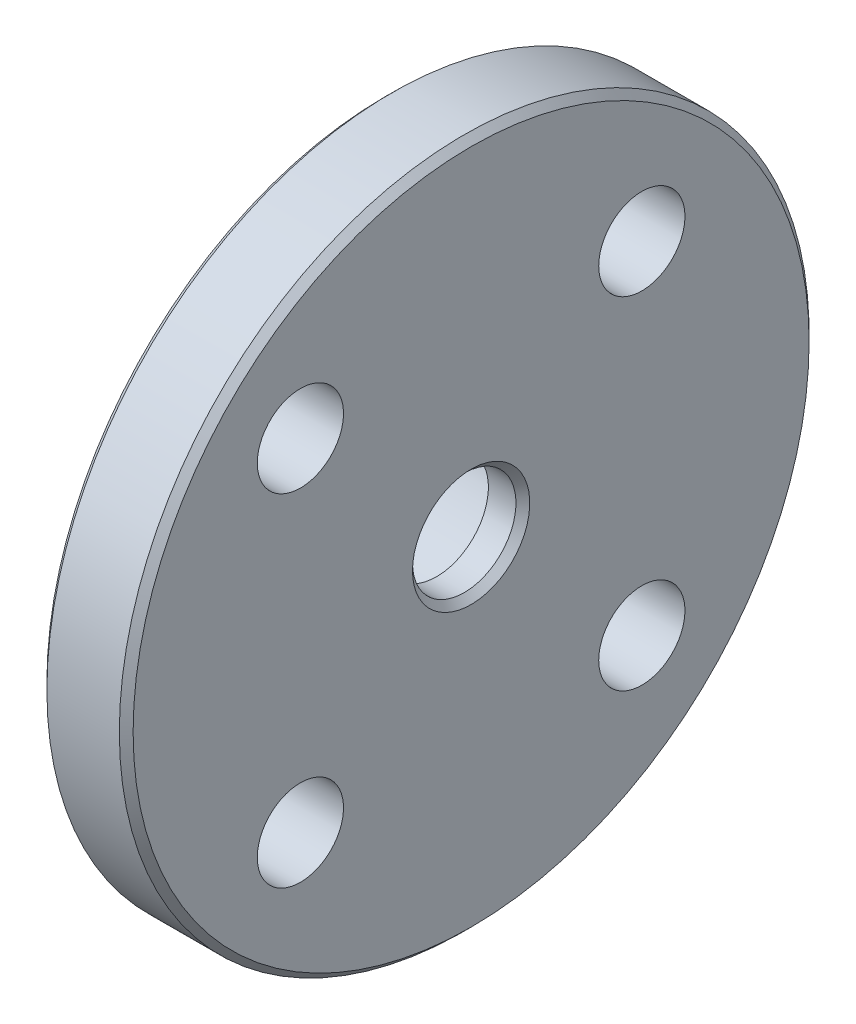
ISO-10303-21;
HEADER;
FILE_DESCRIPTION(('STEP AP214'),'2;1');
FILE_NAME('part.step','',(''),(''),'','','');
FILE_SCHEMA(('AUTOMOTIVE_DESIGN { 1 0 10303 214 1 1 1 1 }'));
ENDSEC;
DATA;
#1=APPLICATION_CONTEXT('core data for automotive mechanical design processes');
#2=APPLICATION_PROTOCOL_DEFINITION('international standard','automotive_design',2000,#1);
#3=PRODUCT_CONTEXT('',#1,'mechanical');
#4=PRODUCT('Part','Part','',(#3));
#5=PRODUCT_RELATED_PRODUCT_CATEGORY('part','',(#4));
#6=PRODUCT_DEFINITION_FORMATION('','',#4);
#7=PRODUCT_DEFINITION_CONTEXT('part definition',#1,'design');
#8=PRODUCT_DEFINITION('design','',#6,#7);
#9=PRODUCT_DEFINITION_SHAPE('','',#8);
#10=(LENGTH_UNIT() NAMED_UNIT(*) SI_UNIT(.MILLI.,.METRE.));
#11=(NAMED_UNIT(*) PLANE_ANGLE_UNIT() SI_UNIT($,.RADIAN.));
#12=(NAMED_UNIT(*) SI_UNIT($,.STERADIAN.) SOLID_ANGLE_UNIT());
#13=UNCERTAINTY_MEASURE_WITH_UNIT(LENGTH_MEASURE(1.E-05),#10,'distance_accuracy_value','');
#14=(GEOMETRIC_REPRESENTATION_CONTEXT(3) GLOBAL_UNCERTAINTY_ASSIGNED_CONTEXT((#13)) GLOBAL_UNIT_ASSIGNED_CONTEXT((#10,
#11,#12)) REPRESENTATION_CONTEXT('',''));
#15=CARTESIAN_POINT('',(0.,0.,0.));
#16=DIRECTION('',(0.,0.,1.));
#17=DIRECTION('',(1.,0.,0.));
#18=AXIS2_PLACEMENT_3D('',#15,#16,#17);
#19=CARTESIAN_POINT('',(0.,0.,0.));
#20=DIRECTION('',(-1.,0.,0.));
#21=DIRECTION('',(0.,0.,1.));
#22=AXIS2_PLACEMENT_3D('',#19,#20,#21);
#23=CYLINDRICAL_SURFACE('',#22,3.);
#24=CARTESIAN_POINT('',(3.5,0.,0.));
#25=DIRECTION('',(-1.,0.,0.));
#26=DIRECTION('',(0.,0.,1.));
#27=AXIS2_PLACEMENT_3D('',#24,#25,#26);
#28=CIRCLE('',#27,3.);
#29=CARTESIAN_POINT('',(3.5,0.,3.));
#30=VERTEX_POINT('',#29);
#31=EDGE_CURVE('E80',#30,#30,#28,.T.);
#32=ORIENTED_EDGE('',*,*,#31,.F.);
#33=EDGE_LOOP('',(#32));
#34=FACE_BOUND('',#33,.T.);
#35=CARTESIAN_POINT('',(0.,0.,0.));
#36=DIRECTION('',(-1.,0.,0.));
#37=DIRECTION('',(0.,0.,1.));
#38=AXIS2_PLACEMENT_3D('',#35,#36,#37);
#39=CIRCLE('',#38,3.);
#40=CARTESIAN_POINT('',(0.,0.,3.));
#41=VERTEX_POINT('',#40);
#42=EDGE_CURVE('E72',#41,#41,#39,.T.);
#43=ORIENTED_EDGE('',*,*,#42,.T.);
#44=EDGE_LOOP('',(#43));
#45=FACE_BOUND('',#44,.T.);
#46=ADVANCED_FACE('F39',(#34,#45),#23,.F.);
#47=CARTESIAN_POINT('',(0.,3.,0.));
#48=DIRECTION('',(1.,0.,0.));
#49=DIRECTION('',(0.,0.,-1.));
#50=AXIS2_PLACEMENT_3D('',#47,#48,#49);
#51=PLANE('',#50);
#52=CARTESIAN_POINT('',(0.,0.,0.));
#53=DIRECTION('',(1.,0.,0.));
#54=DIRECTION('',(0.,0.,-1.));
#55=AXIS2_PLACEMENT_3D('',#52,#53,#54);
#56=CIRCLE('',#55,4.3);
#57=CARTESIAN_POINT('',(0.,0.,-4.3));
#58=VERTEX_POINT('',#57);
#59=EDGE_CURVE('E46',#58,#58,#56,.F.);
#60=ORIENTED_EDGE('',*,*,#59,.T.);
#61=EDGE_LOOP('',(#60));
#62=FACE_BOUND('',#61,.T.);
#63=ORIENTED_EDGE('',*,*,#42,.F.);
#64=EDGE_LOOP('',(#63));
#65=FACE_BOUND('',#64,.T.);
#66=ADVANCED_FACE('F131',(#62,#65),#51,.F.);
#67=CARTESIAN_POINT('',(0.,0.,0.));
#68=DIRECTION('',(-1.,0.,0.));
#69=DIRECTION('',(0.,0.,1.));
#70=AXIS2_PLACEMENT_3D('',#67,#68,#69);
#71=CYLINDRICAL_SURFACE('',#70,4.5);
#72=CARTESIAN_POINT('',(0.200000000000001,0.,0.));
#73=DIRECTION('',(1.,0.,0.));
#74=DIRECTION('',(0.,0.,-1.));
#75=AXIS2_PLACEMENT_3D('',#72,#73,#74);
#76=CIRCLE('',#75,4.5);
#77=CARTESIAN_POINT('',(0.200000000000001,0.,-4.5));
#78=VERTEX_POINT('',#77);
#79=EDGE_CURVE('E10',#78,#78,#76,.T.);
#80=ORIENTED_EDGE('',*,*,#79,.T.);
#81=EDGE_LOOP('',(#80));
#82=FACE_BOUND('',#81,.T.);
#83=CARTESIAN_POINT('',(2.,0.,0.));
#84=DIRECTION('',(-1.,0.,0.));
#85=DIRECTION('',(0.,0.,1.));
#86=AXIS2_PLACEMENT_3D('',#83,#84,#85);
#87=CIRCLE('',#86,4.5);
#88=CARTESIAN_POINT('',(2.,0.,4.5));
#89=VERTEX_POINT('',#88);
#90=EDGE_CURVE('E74',#89,#89,#87,.T.);
#91=ORIENTED_EDGE('',*,*,#90,.T.);
#92=EDGE_LOOP('',(#91));
#93=FACE_BOUND('',#92,.T.);
#94=ADVANCED_FACE('F123',(#82,#93),#71,.T.);
#95=CARTESIAN_POINT('',(2.,4.5,0.));
#96=DIRECTION('',(1.,0.,0.));
#97=DIRECTION('',(0.,0.,-1.));
#98=AXIS2_PLACEMENT_3D('',#95,#96,#97);
#99=PLANE('',#98);
#100=CARTESIAN_POINT('',(2.,0.,0.));
#101=DIRECTION('',(1.,0.,0.));
#102=DIRECTION('',(0.,0.,-1.));
#103=AXIS2_PLACEMENT_3D('',#100,#101,#102);
#104=CIRCLE('',#103,9.79999999999999);
#105=CARTESIAN_POINT('',(2.,0.,-9.79999999999999));
#106=VERTEX_POINT('',#105);
#107=EDGE_CURVE('E49',#106,#106,#104,.F.);
#108=ORIENTED_EDGE('',*,*,#107,.T.);
#109=EDGE_LOOP('',(#108));
#110=FACE_BOUND('',#109,.T.);
#111=CARTESIAN_POINT('',(2.,4.94974746830582,-4.94974746830584));
#112=DIRECTION('',(-1.,0.,0.));
#113=DIRECTION('',(0.,0.,1.));
#114=AXIS2_PLACEMENT_3D('',#111,#112,#113);
#115=CIRCLE('',#114,1.25);
#116=CARTESIAN_POINT('',(2.,4.94974746830582,-3.69974746830584));
#117=VERTEX_POINT('',#116);
#118=EDGE_CURVE('E89',#117,#117,#115,.T.);
#119=ORIENTED_EDGE('',*,*,#118,.F.);
#120=EDGE_LOOP('',(#119));
#121=FACE_BOUND('',#120,.T.);
#122=CARTESIAN_POINT('',(2.,-4.94974746830584,-4.94974746830582));
#123=DIRECTION('',(-1.,0.,0.));
#124=DIRECTION('',(0.,0.,1.));
#125=AXIS2_PLACEMENT_3D('',#122,#123,#124);
#126=CIRCLE('',#125,1.25);
#127=CARTESIAN_POINT('',(2.,-4.94974746830584,-3.69974746830582));
#128=VERTEX_POINT('',#127);
#129=EDGE_CURVE('E96',#128,#128,#126,.T.);
#130=ORIENTED_EDGE('',*,*,#129,.F.);
#131=EDGE_LOOP('',(#130));
#132=FACE_BOUND('',#131,.T.);
#133=CARTESIAN_POINT('',(2.,-4.94974746830582,4.94974746830584));
#134=DIRECTION('',(-1.,0.,0.));
#135=DIRECTION('',(0.,0.,1.));
#136=AXIS2_PLACEMENT_3D('',#133,#134,#135);
#137=CIRCLE('',#136,1.25);
#138=CARTESIAN_POINT('',(2.,-4.94974746830582,6.19974746830584));
#139=VERTEX_POINT('',#138);
#140=EDGE_CURVE('E105',#139,#139,#137,.T.);
#141=ORIENTED_EDGE('',*,*,#140,.F.);
#142=EDGE_LOOP('',(#141));
#143=FACE_BOUND('',#142,.T.);
#144=CARTESIAN_POINT('',(2.,4.94974746830584,4.94974746830582));
#145=DIRECTION('',(-1.,0.,0.));
#146=DIRECTION('',(0.,0.,1.));
#147=AXIS2_PLACEMENT_3D('',#144,#145,#146);
#148=CIRCLE('',#147,1.25);
#149=CARTESIAN_POINT('',(2.,4.94974746830584,6.19974746830582));
#150=VERTEX_POINT('',#149);
#151=EDGE_CURVE('E84',#150,#150,#148,.T.);
#152=ORIENTED_EDGE('',*,*,#151,.F.);
#153=EDGE_LOOP('',(#152));
#154=FACE_BOUND('',#153,.T.);
#155=ORIENTED_EDGE('',*,*,#90,.F.);
#156=EDGE_LOOP('',(#155));
#157=FACE_BOUND('',#156,.T.);
#158=ADVANCED_FACE('F118',(#110,#121,#132,#143,#154,#157),#99,.F.);
#159=CARTESIAN_POINT('',(0.,0.,0.));
#160=DIRECTION('',(-1.,0.,0.));
#161=DIRECTION('',(0.,0.,1.));
#162=AXIS2_PLACEMENT_3D('',#159,#160,#161);
#163=CYLINDRICAL_SURFACE('',#162,10.);
#164=CARTESIAN_POINT('',(4.3,0.,0.));
#165=DIRECTION('',(-1.,0.,0.));
#166=DIRECTION('',(0.,0.,1.));
#167=AXIS2_PLACEMENT_3D('',#164,#165,#166);
#168=CIRCLE('',#167,10.);
#169=CARTESIAN_POINT('',(4.3,0.,10.));
#170=VERTEX_POINT('',#169);
#171=EDGE_CURVE('E53',#170,#170,#168,.T.);
#172=ORIENTED_EDGE('',*,*,#171,.T.);
#173=EDGE_LOOP('',(#172));
#174=FACE_BOUND('',#173,.T.);
#175=CARTESIAN_POINT('',(2.20000000000001,0.,0.));
#176=DIRECTION('',(1.,0.,0.));
#177=DIRECTION('',(0.,0.,-1.));
#178=AXIS2_PLACEMENT_3D('',#175,#176,#177);
#179=CIRCLE('',#178,10.);
#180=CARTESIAN_POINT('',(2.20000000000001,0.,-10.));
#181=VERTEX_POINT('',#180);
#182=EDGE_CURVE('E56',#181,#181,#179,.T.);
#183=ORIENTED_EDGE('',*,*,#182,.T.);
#184=EDGE_LOOP('',(#183));
#185=FACE_BOUND('',#184,.T.);
#186=ADVANCED_FACE('F125',(#174,#185),#163,.T.);
#187=CARTESIAN_POINT('',(4.5,10.,0.));
#188=DIRECTION('',(-1.,0.,0.));
#189=DIRECTION('',(0.,0.,1.));
#190=AXIS2_PLACEMENT_3D('',#187,#188,#189);
#191=PLANE('',#190);
#192=CARTESIAN_POINT('',(4.5,0.,0.));
#193=DIRECTION('',(-1.,0.,0.));
#194=DIRECTION('',(0.,0.,1.));
#195=AXIS2_PLACEMENT_3D('',#192,#193,#194);
#196=CIRCLE('',#195,1.7);
#197=CARTESIAN_POINT('',(4.5,0.,1.7));
#198=VERTEX_POINT('',#197);
#199=EDGE_CURVE('E65',#198,#198,#196,.T.);
#200=ORIENTED_EDGE('',*,*,#199,.T.);
#201=EDGE_LOOP('',(#200));
#202=FACE_BOUND('',#201,.T.);
#203=CARTESIAN_POINT('',(4.5,0.,0.));
#204=DIRECTION('',(-1.,0.,0.));
#205=DIRECTION('',(0.,0.,1.));
#206=AXIS2_PLACEMENT_3D('',#203,#204,#205);
#207=CIRCLE('',#206,9.79999999999999);
#208=CARTESIAN_POINT('',(4.5,0.,9.79999999999999));
#209=VERTEX_POINT('',#208);
#210=EDGE_CURVE('E68',#209,#209,#207,.F.);
#211=ORIENTED_EDGE('',*,*,#210,.T.);
#212=EDGE_LOOP('',(#211));
#213=FACE_BOUND('',#212,.T.);
#214=CARTESIAN_POINT('',(4.5,4.94974746830582,-4.94974746830584));
#215=DIRECTION('',(-1.,0.,0.));
#216=DIRECTION('',(0.,0.,1.));
#217=AXIS2_PLACEMENT_3D('',#214,#215,#216);
#218=CIRCLE('',#217,1.25);
#219=CARTESIAN_POINT('',(4.5,4.94974746830582,-3.69974746830584));
#220=VERTEX_POINT('',#219);
#221=EDGE_CURVE('E91',#220,#220,#218,.T.);
#222=ORIENTED_EDGE('',*,*,#221,.T.);
#223=EDGE_LOOP('',(#222));
#224=FACE_BOUND('',#223,.T.);
#225=CARTESIAN_POINT('',(4.5,-4.94974746830584,-4.94974746830582));
#226=DIRECTION('',(-1.,0.,0.));
#227=DIRECTION('',(0.,0.,1.));
#228=AXIS2_PLACEMENT_3D('',#225,#226,#227);
#229=CIRCLE('',#228,1.25);
#230=CARTESIAN_POINT('',(4.5,-4.94974746830584,-3.69974746830582));
#231=VERTEX_POINT('',#230);
#232=EDGE_CURVE('E97',#231,#231,#229,.T.);
#233=ORIENTED_EDGE('',*,*,#232,.T.);
#234=EDGE_LOOP('',(#233));
#235=FACE_BOUND('',#234,.T.);
#236=CARTESIAN_POINT('',(4.5,-4.94974746830582,4.94974746830584));
#237=DIRECTION('',(-1.,0.,0.));
#238=DIRECTION('',(0.,0.,1.));
#239=AXIS2_PLACEMENT_3D('',#236,#237,#238);
#240=CIRCLE('',#239,1.25);
#241=CARTESIAN_POINT('',(4.5,-4.94974746830582,6.19974746830584));
#242=VERTEX_POINT('',#241);
#243=EDGE_CURVE('E87',#242,#242,#240,.T.);
#244=ORIENTED_EDGE('',*,*,#243,.T.);
#245=EDGE_LOOP('',(#244));
#246=FACE_BOUND('',#245,.T.);
#247=CARTESIAN_POINT('',(4.5,4.94974746830584,4.94974746830582));
#248=DIRECTION('',(-1.,0.,0.));
#249=DIRECTION('',(0.,0.,1.));
#250=AXIS2_PLACEMENT_3D('',#247,#248,#249);
#251=CIRCLE('',#250,1.25);
#252=CARTESIAN_POINT('',(4.5,4.94974746830584,6.19974746830582));
#253=VERTEX_POINT('',#252);
#254=EDGE_CURVE('E83',#253,#253,#251,.T.);
#255=ORIENTED_EDGE('',*,*,#254,.T.);
#256=EDGE_LOOP('',(#255));
#257=FACE_BOUND('',#256,.T.);
#258=ADVANCED_FACE('F107',(#202,#213,#224,#235,#246,#257),#191,.F.);
#259=CARTESIAN_POINT('',(0.,0.,0.));
#260=DIRECTION('',(-1.,0.,0.));
#261=DIRECTION('',(0.,0.,1.));
#262=AXIS2_PLACEMENT_3D('',#259,#260,#261);
#263=CYLINDRICAL_SURFACE('',#262,1.5);
#264=CARTESIAN_POINT('',(4.30000000000001,0.,0.));
#265=DIRECTION('',(-1.,0.,0.));
#266=DIRECTION('',(0.,0.,1.));
#267=AXIS2_PLACEMENT_3D('',#264,#265,#266);
#268=CIRCLE('',#267,1.5);
#269=CARTESIAN_POINT('',(4.30000000000001,0.,1.5));
#270=VERTEX_POINT('',#269);
#271=EDGE_CURVE('E62',#270,#270,#268,.F.);
#272=ORIENTED_EDGE('',*,*,#271,.T.);
#273=EDGE_LOOP('',(#272));
#274=FACE_BOUND('',#273,.T.);
#275=CARTESIAN_POINT('',(3.5,0.,0.));
#276=DIRECTION('',(-1.,0.,0.));
#277=DIRECTION('',(0.,0.,1.));
#278=AXIS2_PLACEMENT_3D('',#275,#276,#277);
#279=CIRCLE('',#278,1.5);
#280=CARTESIAN_POINT('',(3.5,0.,1.5));
#281=VERTEX_POINT('',#280);
#282=EDGE_CURVE('E77',#281,#281,#279,.T.);
#283=ORIENTED_EDGE('',*,*,#282,.T.);
#284=EDGE_LOOP('',(#283));
#285=FACE_BOUND('',#284,.T.);
#286=ADVANCED_FACE('F184',(#274,#285),#263,.F.);
#287=CARTESIAN_POINT('',(3.5,1.5,0.));
#288=DIRECTION('',(1.,0.,0.));
#289=DIRECTION('',(0.,0.,-1.));
#290=AXIS2_PLACEMENT_3D('',#287,#288,#289);
#291=PLANE('',#290);
#292=ORIENTED_EDGE('',*,*,#282,.F.);
#293=EDGE_LOOP('',(#292));
#294=FACE_BOUND('',#293,.T.);
#295=ORIENTED_EDGE('',*,*,#31,.T.);
#296=EDGE_LOOP('',(#295));
#297=FACE_BOUND('',#296,.T.);
#298=ADVANCED_FACE('F182',(#294,#297),#291,.F.);
#299=CARTESIAN_POINT('',(4.5,4.94974746830584,4.94974746830582));
#300=DIRECTION('',(-1.,0.,0.));
#301=DIRECTION('',(0.,0.,1.));
#302=AXIS2_PLACEMENT_3D('',#299,#300,#301);
#303=CYLINDRICAL_SURFACE('',#302,1.25);
#304=CARTESIAN_POINT('',(4.5,4.94974746830584,6.19974746830582));
#305=CARTESIAN_POINT('',(4.47395833333333,4.94974746830584,6.19974746830582));
#306=CARTESIAN_POINT('',(4.44791666666667,4.94974746830584,6.19974746830582));
#307=CARTESIAN_POINT('',(4.39583333333333,4.94974746830584,6.19974746830582));
#308=CARTESIAN_POINT('',(4.36979166666667,4.94974746830584,6.19974746830582));
#309=CARTESIAN_POINT('',(4.31770833333333,4.94974746830584,6.19974746830582));
#310=CARTESIAN_POINT('',(4.29166666666667,4.94974746830584,6.19974746830582));
#311=CARTESIAN_POINT('',(4.23958333333333,4.94974746830584,6.19974746830582));
#312=CARTESIAN_POINT('',(4.21354166666667,4.94974746830584,6.19974746830582));
#313=CARTESIAN_POINT('',(4.16145833333333,4.94974746830584,6.19974746830582));
#314=CARTESIAN_POINT('',(4.13541666666667,4.94974746830584,6.19974746830582));
#315=CARTESIAN_POINT('',(4.08333333333333,4.94974746830584,6.19974746830582));
#316=CARTESIAN_POINT('',(4.05729166666667,4.94974746830584,6.19974746830582));
#317=CARTESIAN_POINT('',(4.00520833333333,4.94974746830584,6.19974746830582));
#318=CARTESIAN_POINT('',(3.97916666666667,4.94974746830584,6.19974746830582));
#319=CARTESIAN_POINT('',(3.92708333333333,4.94974746830584,6.19974746830582));
#320=CARTESIAN_POINT('',(3.90104166666667,4.94974746830584,6.19974746830582));
#321=CARTESIAN_POINT('',(3.84895833333333,4.94974746830584,6.19974746830582));
#322=CARTESIAN_POINT('',(3.82291666666667,4.94974746830584,6.19974746830582));
#323=CARTESIAN_POINT('',(3.77083333333333,4.94974746830584,6.19974746830582));
#324=CARTESIAN_POINT('',(3.74479166666667,4.94974746830584,6.19974746830582));
#325=CARTESIAN_POINT('',(3.69270833333333,4.94974746830584,6.19974746830582));
#326=CARTESIAN_POINT('',(3.66666666666667,4.94974746830584,6.19974746830582));
#327=CARTESIAN_POINT('',(3.61458333333333,4.94974746830584,6.19974746830582));
#328=CARTESIAN_POINT('',(3.58854166666667,4.94974746830584,6.19974746830582));
#329=CARTESIAN_POINT('',(3.53645833333333,4.94974746830584,6.19974746830582));
#330=CARTESIAN_POINT('',(3.51041666666667,4.94974746830584,6.19974746830582));
#331=CARTESIAN_POINT('',(3.45833333333333,4.94974746830584,6.19974746830582));
#332=CARTESIAN_POINT('',(3.43229166666667,4.94974746830584,6.19974746830582));
#333=CARTESIAN_POINT('',(3.38020833333333,4.94974746830584,6.19974746830582));
#334=CARTESIAN_POINT('',(3.35416666666667,4.94974746830584,6.19974746830582));
#335=CARTESIAN_POINT('',(3.30208333333333,4.94974746830584,6.19974746830582));
#336=CARTESIAN_POINT('',(3.27604166666667,4.94974746830584,6.19974746830582));
#337=CARTESIAN_POINT('',(3.22395833333333,4.94974746830584,6.19974746830582));
#338=CARTESIAN_POINT('',(3.19791666666667,4.94974746830584,6.19974746830582));
#339=CARTESIAN_POINT('',(3.14583333333333,4.94974746830584,6.19974746830582));
#340=CARTESIAN_POINT('',(3.11979166666667,4.94974746830584,6.19974746830582));
#341=CARTESIAN_POINT('',(3.06770833333333,4.94974746830584,6.19974746830582));
#342=CARTESIAN_POINT('',(3.04166666666667,4.94974746830584,6.19974746830582));
#343=CARTESIAN_POINT('',(2.98958333333333,4.94974746830584,6.19974746830582));
#344=CARTESIAN_POINT('',(2.96354166666667,4.94974746830584,6.19974746830582));
#345=CARTESIAN_POINT('',(2.91145833333333,4.94974746830584,6.19974746830582));
#346=CARTESIAN_POINT('',(2.88541666666667,4.94974746830584,6.19974746830582));
#347=CARTESIAN_POINT('',(2.83333333333333,4.94974746830584,6.19974746830582));
#348=CARTESIAN_POINT('',(2.80729166666667,4.94974746830584,6.19974746830582));
#349=CARTESIAN_POINT('',(2.75520833333333,4.94974746830584,6.19974746830582));
#350=CARTESIAN_POINT('',(2.72916666666667,4.94974746830584,6.19974746830582));
#351=CARTESIAN_POINT('',(2.67708333333333,4.94974746830584,6.19974746830582));
#352=CARTESIAN_POINT('',(2.65104166666667,4.94974746830584,6.19974746830582));
#353=CARTESIAN_POINT('',(2.59895833333333,4.94974746830584,6.19974746830582));
#354=CARTESIAN_POINT('',(2.57291666666667,4.94974746830584,6.19974746830582));
#355=CARTESIAN_POINT('',(2.52083333333333,4.94974746830584,6.19974746830582));
#356=CARTESIAN_POINT('',(2.49479166666667,4.94974746830584,6.19974746830582));
#357=CARTESIAN_POINT('',(2.44270833333333,4.94974746830584,6.19974746830582));
#358=CARTESIAN_POINT('',(2.41666666666667,4.94974746830584,6.19974746830582));
#359=CARTESIAN_POINT('',(2.36458333333333,4.94974746830584,6.19974746830582));
#360=CARTESIAN_POINT('',(2.33854166666667,4.94974746830584,6.19974746830582));
#361=CARTESIAN_POINT('',(2.28645833333333,4.94974746830584,6.19974746830582));
#362=CARTESIAN_POINT('',(2.26041666666667,4.94974746830584,6.19974746830582));
#363=CARTESIAN_POINT('',(2.20833333333333,4.94974746830584,6.19974746830582));
#364=CARTESIAN_POINT('',(2.18229166666667,4.94974746830584,6.19974746830582));
#365=CARTESIAN_POINT('',(2.13020833333333,4.94974746830584,6.19974746830582));
#366=CARTESIAN_POINT('',(2.10416666666667,4.94974746830584,6.19974746830582));
#367=CARTESIAN_POINT('',(2.05208333333333,4.94974746830584,6.19974746830582));
#368=CARTESIAN_POINT('',(2.02604166666667,4.94974746830584,6.19974746830582));
#369=CARTESIAN_POINT('',(2.,4.94974746830584,6.19974746830582));
#370=B_SPLINE_CURVE_WITH_KNOTS('',3,(#304,#305,#306,#307,#308,#309,#310,#311,#312,#313,#314,
#315,#316,#317,#318,#319,#320,#321,#322,#323,#324,#325,#326,#327,#328,#329,#330,#331,#332,#333,
#334,#335,#336,#337,#338,#339,#340,#341,#342,#343,#344,#345,#346,#347,#348,#349,#350,#351,#352,
#353,#354,#355,#356,#357,#358,#359,#360,#361,#362,#363,#364,#365,#366,#367,#368,#369),
.UNSPECIFIED.,.F.,.F.,(4,2,2,2,2,2,2,2,2,2,2,2,2,2,2,2,2,2,2,2,2,2,2,2,2,2,2,2,2,2,2,2,4),(0.,
0.0781249999999992,0.156249999999999,0.234374999999999,0.312499999999999,0.390625,0.46875,
0.546875,0.625,0.703125,0.78125,0.859375,0.9375,1.015625,1.09375,1.171875,1.25,1.328125,1.40625,
1.484375,1.5625,1.640625,1.71875,1.796875,1.875,1.953125,2.03125,2.109375,2.1875,2.265625,
2.34375,2.421875,2.5),.UNSPECIFIED.);
#371=EDGE_CURVE('BSEAM113',#253,#150,#370,.T.);
#372=ORIENTED_EDGE('',*,*,#254,.F.);
#373=ORIENTED_EDGE('',*,*,#151,.T.);
#374=ORIENTED_EDGE('',*,*,#371,.T.);
#375=ORIENTED_EDGE('',*,*,#371,.F.);
#376=EDGE_LOOP('',(#372,#374,#373,#375));
#377=FACE_BOUND('',#376,.T.);
#378=ADVANCED_FACE('F113',(#377),#303,.F.);
#379=CARTESIAN_POINT('',(4.5,-4.94974746830582,4.94974746830584));
#380=DIRECTION('',(-1.,0.,0.));
#381=DIRECTION('',(0.,0.,1.));
#382=AXIS2_PLACEMENT_3D('',#379,#380,#381);
#383=CYLINDRICAL_SURFACE('',#382,1.25);
#384=CARTESIAN_POINT('',(4.5,-4.94974746830582,6.19974746830584));
#385=CARTESIAN_POINT('',(4.47395833333333,-4.94974746830582,6.19974746830584));
#386=CARTESIAN_POINT('',(4.44791666666667,-4.94974746830582,6.19974746830584));
#387=CARTESIAN_POINT('',(4.39583333333333,-4.94974746830582,6.19974746830584));
#388=CARTESIAN_POINT('',(4.36979166666667,-4.94974746830582,6.19974746830584));
#389=CARTESIAN_POINT('',(4.31770833333333,-4.94974746830582,6.19974746830584));
#390=CARTESIAN_POINT('',(4.29166666666667,-4.94974746830582,6.19974746830584));
#391=CARTESIAN_POINT('',(4.23958333333333,-4.94974746830582,6.19974746830584));
#392=CARTESIAN_POINT('',(4.21354166666667,-4.94974746830582,6.19974746830584));
#393=CARTESIAN_POINT('',(4.16145833333333,-4.94974746830582,6.19974746830584));
#394=CARTESIAN_POINT('',(4.13541666666667,-4.94974746830582,6.19974746830584));
#395=CARTESIAN_POINT('',(4.08333333333333,-4.94974746830582,6.19974746830584));
#396=CARTESIAN_POINT('',(4.05729166666667,-4.94974746830582,6.19974746830584));
#397=CARTESIAN_POINT('',(4.00520833333333,-4.94974746830582,6.19974746830584));
#398=CARTESIAN_POINT('',(3.97916666666667,-4.94974746830582,6.19974746830584));
#399=CARTESIAN_POINT('',(3.92708333333333,-4.94974746830582,6.19974746830584));
#400=CARTESIAN_POINT('',(3.90104166666667,-4.94974746830582,6.19974746830584));
#401=CARTESIAN_POINT('',(3.84895833333333,-4.94974746830582,6.19974746830584));
#402=CARTESIAN_POINT('',(3.82291666666667,-4.94974746830582,6.19974746830584));
#403=CARTESIAN_POINT('',(3.77083333333333,-4.94974746830582,6.19974746830584));
#404=CARTESIAN_POINT('',(3.74479166666667,-4.94974746830582,6.19974746830584));
#405=CARTESIAN_POINT('',(3.69270833333333,-4.94974746830582,6.19974746830584));
#406=CARTESIAN_POINT('',(3.66666666666667,-4.94974746830582,6.19974746830584));
#407=CARTESIAN_POINT('',(3.61458333333333,-4.94974746830582,6.19974746830584));
#408=CARTESIAN_POINT('',(3.58854166666667,-4.94974746830582,6.19974746830584));
#409=CARTESIAN_POINT('',(3.53645833333333,-4.94974746830582,6.19974746830584));
#410=CARTESIAN_POINT('',(3.51041666666667,-4.94974746830582,6.19974746830584));
#411=CARTESIAN_POINT('',(3.45833333333333,-4.94974746830582,6.19974746830584));
#412=CARTESIAN_POINT('',(3.43229166666667,-4.94974746830582,6.19974746830584));
#413=CARTESIAN_POINT('',(3.38020833333333,-4.94974746830582,6.19974746830584));
#414=CARTESIAN_POINT('',(3.35416666666667,-4.94974746830582,6.19974746830584));
#415=CARTESIAN_POINT('',(3.30208333333333,-4.94974746830582,6.19974746830584));
#416=CARTESIAN_POINT('',(3.27604166666667,-4.94974746830582,6.19974746830584));
#417=CARTESIAN_POINT('',(3.22395833333333,-4.94974746830582,6.19974746830584));
#418=CARTESIAN_POINT('',(3.19791666666667,-4.94974746830582,6.19974746830584));
#419=CARTESIAN_POINT('',(3.14583333333333,-4.94974746830582,6.19974746830584));
#420=CARTESIAN_POINT('',(3.11979166666667,-4.94974746830582,6.19974746830584));
#421=CARTESIAN_POINT('',(3.06770833333333,-4.94974746830582,6.19974746830584));
#422=CARTESIAN_POINT('',(3.04166666666667,-4.94974746830582,6.19974746830584));
#423=CARTESIAN_POINT('',(2.98958333333333,-4.94974746830582,6.19974746830584));
#424=CARTESIAN_POINT('',(2.96354166666667,-4.94974746830582,6.19974746830584));
#425=CARTESIAN_POINT('',(2.91145833333333,-4.94974746830582,6.19974746830584));
#426=CARTESIAN_POINT('',(2.88541666666667,-4.94974746830582,6.19974746830584));
#427=CARTESIAN_POINT('',(2.83333333333333,-4.94974746830582,6.19974746830584));
#428=CARTESIAN_POINT('',(2.80729166666667,-4.94974746830582,6.19974746830584));
#429=CARTESIAN_POINT('',(2.75520833333333,-4.94974746830582,6.19974746830584));
#430=CARTESIAN_POINT('',(2.72916666666667,-4.94974746830582,6.19974746830584));
#431=CARTESIAN_POINT('',(2.67708333333333,-4.94974746830582,6.19974746830584));
#432=CARTESIAN_POINT('',(2.65104166666667,-4.94974746830582,6.19974746830584));
#433=CARTESIAN_POINT('',(2.59895833333333,-4.94974746830582,6.19974746830584));
#434=CARTESIAN_POINT('',(2.57291666666667,-4.94974746830582,6.19974746830584));
#435=CARTESIAN_POINT('',(2.52083333333333,-4.94974746830582,6.19974746830584));
#436=CARTESIAN_POINT('',(2.49479166666667,-4.94974746830582,6.19974746830584));
#437=CARTESIAN_POINT('',(2.44270833333333,-4.94974746830582,6.19974746830584));
#438=CARTESIAN_POINT('',(2.41666666666667,-4.94974746830582,6.19974746830584));
#439=CARTESIAN_POINT('',(2.36458333333333,-4.94974746830582,6.19974746830584));
#440=CARTESIAN_POINT('',(2.33854166666667,-4.94974746830582,6.19974746830584));
#441=CARTESIAN_POINT('',(2.28645833333333,-4.94974746830582,6.19974746830584));
#442=CARTESIAN_POINT('',(2.26041666666667,-4.94974746830582,6.19974746830584));
#443=CARTESIAN_POINT('',(2.20833333333333,-4.94974746830582,6.19974746830584));
#444=CARTESIAN_POINT('',(2.18229166666667,-4.94974746830582,6.19974746830584));
#445=CARTESIAN_POINT('',(2.13020833333333,-4.94974746830582,6.19974746830584));
#446=CARTESIAN_POINT('',(2.10416666666667,-4.94974746830582,6.19974746830584));
#447=CARTESIAN_POINT('',(2.05208333333333,-4.94974746830582,6.19974746830584));
#448=CARTESIAN_POINT('',(2.02604166666667,-4.94974746830582,6.19974746830584));
#449=CARTESIAN_POINT('',(2.,-4.94974746830582,6.19974746830584));
#450=B_SPLINE_CURVE_WITH_KNOTS('',3,(#384,#385,#386,#387,#388,#389,#390,#391,#392,#393,#394,
#395,#396,#397,#398,#399,#400,#401,#402,#403,#404,#405,#406,#407,#408,#409,#410,#411,#412,#413,
#414,#415,#416,#417,#418,#419,#420,#421,#422,#423,#424,#425,#426,#427,#428,#429,#430,#431,#432,
#433,#434,#435,#436,#437,#438,#439,#440,#441,#442,#443,#444,#445,#446,#447,#448,#449),
.UNSPECIFIED.,.F.,.F.,(4,2,2,2,2,2,2,2,2,2,2,2,2,2,2,2,2,2,2,2,2,2,2,2,2,2,2,2,2,2,2,2,4),(0.,
0.0781249999999992,0.156249999999999,0.234374999999999,0.312499999999999,0.390625,0.46875,
0.546875,0.625,0.703125,0.78125,0.859375,0.9375,1.015625,1.09375,1.171875,1.25,1.328125,1.40625,
1.484375,1.5625,1.640625,1.71875,1.796875,1.875,1.953125,2.03125,2.109375,2.1875,2.265625,
2.34375,2.421875,2.5),.UNSPECIFIED.);
#451=EDGE_CURVE('BSEAM112',#242,#139,#450,.T.);
#452=ORIENTED_EDGE('',*,*,#243,.F.);
#453=ORIENTED_EDGE('',*,*,#140,.T.);
#454=ORIENTED_EDGE('',*,*,#451,.T.);
#455=ORIENTED_EDGE('',*,*,#451,.F.);
#456=EDGE_LOOP('',(#452,#454,#453,#455));
#457=FACE_BOUND('',#456,.T.);
#458=ADVANCED_FACE('F112',(#457),#383,.F.);
#459=CARTESIAN_POINT('',(4.5,-4.94974746830584,-4.94974746830582));
#460=DIRECTION('',(-1.,0.,0.));
#461=DIRECTION('',(0.,0.,1.));
#462=AXIS2_PLACEMENT_3D('',#459,#460,#461);
#463=CYLINDRICAL_SURFACE('',#462,1.25);
#464=CARTESIAN_POINT('',(4.5,-4.94974746830584,-3.69974746830582));
#465=CARTESIAN_POINT('',(4.47395833333333,-4.94974746830584,-3.69974746830582));
#466=CARTESIAN_POINT('',(4.44791666666667,-4.94974746830584,-3.69974746830582));
#467=CARTESIAN_POINT('',(4.39583333333333,-4.94974746830584,-3.69974746830582));
#468=CARTESIAN_POINT('',(4.36979166666667,-4.94974746830584,-3.69974746830582));
#469=CARTESIAN_POINT('',(4.31770833333333,-4.94974746830584,-3.69974746830582));
#470=CARTESIAN_POINT('',(4.29166666666667,-4.94974746830584,-3.69974746830582));
#471=CARTESIAN_POINT('',(4.23958333333333,-4.94974746830584,-3.69974746830582));
#472=CARTESIAN_POINT('',(4.21354166666667,-4.94974746830584,-3.69974746830582));
#473=CARTESIAN_POINT('',(4.16145833333333,-4.94974746830584,-3.69974746830582));
#474=CARTESIAN_POINT('',(4.13541666666667,-4.94974746830584,-3.69974746830582));
#475=CARTESIAN_POINT('',(4.08333333333333,-4.94974746830584,-3.69974746830582));
#476=CARTESIAN_POINT('',(4.05729166666667,-4.94974746830584,-3.69974746830582));
#477=CARTESIAN_POINT('',(4.00520833333333,-4.94974746830584,-3.69974746830582));
#478=CARTESIAN_POINT('',(3.97916666666667,-4.94974746830584,-3.69974746830582));
#479=CARTESIAN_POINT('',(3.92708333333333,-4.94974746830584,-3.69974746830582));
#480=CARTESIAN_POINT('',(3.90104166666667,-4.94974746830584,-3.69974746830582));
#481=CARTESIAN_POINT('',(3.84895833333333,-4.94974746830584,-3.69974746830582));
#482=CARTESIAN_POINT('',(3.82291666666667,-4.94974746830584,-3.69974746830582));
#483=CARTESIAN_POINT('',(3.77083333333333,-4.94974746830584,-3.69974746830582));
#484=CARTESIAN_POINT('',(3.74479166666667,-4.94974746830584,-3.69974746830582));
#485=CARTESIAN_POINT('',(3.69270833333333,-4.94974746830584,-3.69974746830582));
#486=CARTESIAN_POINT('',(3.66666666666667,-4.94974746830584,-3.69974746830582));
#487=CARTESIAN_POINT('',(3.61458333333333,-4.94974746830584,-3.69974746830582));
#488=CARTESIAN_POINT('',(3.58854166666667,-4.94974746830584,-3.69974746830582));
#489=CARTESIAN_POINT('',(3.53645833333333,-4.94974746830584,-3.69974746830582));
#490=CARTESIAN_POINT('',(3.51041666666667,-4.94974746830584,-3.69974746830582));
#491=CARTESIAN_POINT('',(3.45833333333333,-4.94974746830584,-3.69974746830582));
#492=CARTESIAN_POINT('',(3.43229166666667,-4.94974746830584,-3.69974746830582));
#493=CARTESIAN_POINT('',(3.38020833333333,-4.94974746830584,-3.69974746830582));
#494=CARTESIAN_POINT('',(3.35416666666667,-4.94974746830584,-3.69974746830582));
#495=CARTESIAN_POINT('',(3.30208333333333,-4.94974746830584,-3.69974746830582));
#496=CARTESIAN_POINT('',(3.27604166666667,-4.94974746830584,-3.69974746830582));
#497=CARTESIAN_POINT('',(3.22395833333333,-4.94974746830584,-3.69974746830582));
#498=CARTESIAN_POINT('',(3.19791666666667,-4.94974746830584,-3.69974746830582));
#499=CARTESIAN_POINT('',(3.14583333333333,-4.94974746830584,-3.69974746830582));
#500=CARTESIAN_POINT('',(3.11979166666667,-4.94974746830584,-3.69974746830582));
#501=CARTESIAN_POINT('',(3.06770833333333,-4.94974746830584,-3.69974746830582));
#502=CARTESIAN_POINT('',(3.04166666666667,-4.94974746830584,-3.69974746830582));
#503=CARTESIAN_POINT('',(2.98958333333333,-4.94974746830584,-3.69974746830582));
#504=CARTESIAN_POINT('',(2.96354166666667,-4.94974746830584,-3.69974746830582));
#505=CARTESIAN_POINT('',(2.91145833333333,-4.94974746830584,-3.69974746830582));
#506=CARTESIAN_POINT('',(2.88541666666667,-4.94974746830584,-3.69974746830582));
#507=CARTESIAN_POINT('',(2.83333333333333,-4.94974746830584,-3.69974746830582));
#508=CARTESIAN_POINT('',(2.80729166666667,-4.94974746830584,-3.69974746830582));
#509=CARTESIAN_POINT('',(2.75520833333333,-4.94974746830584,-3.69974746830582));
#510=CARTESIAN_POINT('',(2.72916666666667,-4.94974746830584,-3.69974746830582));
#511=CARTESIAN_POINT('',(2.67708333333333,-4.94974746830584,-3.69974746830582));
#512=CARTESIAN_POINT('',(2.65104166666667,-4.94974746830584,-3.69974746830582));
#513=CARTESIAN_POINT('',(2.59895833333333,-4.94974746830584,-3.69974746830582));
#514=CARTESIAN_POINT('',(2.57291666666667,-4.94974746830584,-3.69974746830582));
#515=CARTESIAN_POINT('',(2.52083333333333,-4.94974746830584,-3.69974746830582));
#516=CARTESIAN_POINT('',(2.49479166666667,-4.94974746830584,-3.69974746830582));
#517=CARTESIAN_POINT('',(2.44270833333333,-4.94974746830584,-3.69974746830582));
#518=CARTESIAN_POINT('',(2.41666666666667,-4.94974746830584,-3.69974746830582));
#519=CARTESIAN_POINT('',(2.36458333333333,-4.94974746830584,-3.69974746830582));
#520=CARTESIAN_POINT('',(2.33854166666667,-4.94974746830584,-3.69974746830582));
#521=CARTESIAN_POINT('',(2.28645833333333,-4.94974746830584,-3.69974746830582));
#522=CARTESIAN_POINT('',(2.26041666666667,-4.94974746830584,-3.69974746830582));
#523=CARTESIAN_POINT('',(2.20833333333333,-4.94974746830584,-3.69974746830582));
#524=CARTESIAN_POINT('',(2.18229166666667,-4.94974746830584,-3.69974746830582));
#525=CARTESIAN_POINT('',(2.13020833333333,-4.94974746830584,-3.69974746830582));
#526=CARTESIAN_POINT('',(2.10416666666667,-4.94974746830584,-3.69974746830582));
#527=CARTESIAN_POINT('',(2.05208333333333,-4.94974746830584,-3.69974746830582));
#528=CARTESIAN_POINT('',(2.02604166666667,-4.94974746830584,-3.69974746830582));
#529=CARTESIAN_POINT('',(2.,-4.94974746830584,-3.69974746830582));
#530=B_SPLINE_CURVE_WITH_KNOTS('',3,(#464,#465,#466,#467,#468,#469,#470,#471,#472,#473,#474,
#475,#476,#477,#478,#479,#480,#481,#482,#483,#484,#485,#486,#487,#488,#489,#490,#491,#492,#493,
#494,#495,#496,#497,#498,#499,#500,#501,#502,#503,#504,#505,#506,#507,#508,#509,#510,#511,#512,
#513,#514,#515,#516,#517,#518,#519,#520,#521,#522,#523,#524,#525,#526,#527,#528,#529),
.UNSPECIFIED.,.F.,.F.,(4,2,2,2,2,2,2,2,2,2,2,2,2,2,2,2,2,2,2,2,2,2,2,2,2,2,2,2,2,2,2,2,4),(0.,
0.0781249999999992,0.156249999999999,0.234374999999999,0.312499999999999,0.390625,0.46875,
0.546875,0.625,0.703125,0.78125,0.859375,0.9375,1.015625,1.09375,1.171875,1.25,1.328125,1.40625,
1.484375,1.5625,1.640625,1.71875,1.796875,1.875,1.953125,2.03125,2.109375,2.1875,2.265625,
2.34375,2.421875,2.5),.UNSPECIFIED.);
#531=EDGE_CURVE('BSEAM111',#231,#128,#530,.T.);
#532=ORIENTED_EDGE('',*,*,#232,.F.);
#533=ORIENTED_EDGE('',*,*,#129,.T.);
#534=ORIENTED_EDGE('',*,*,#531,.T.);
#535=ORIENTED_EDGE('',*,*,#531,.F.);
#536=EDGE_LOOP('',(#532,#534,#533,#535));
#537=FACE_BOUND('',#536,.T.);
#538=ADVANCED_FACE('F111',(#537),#463,.F.);
#539=CARTESIAN_POINT('',(4.5,4.94974746830582,-4.94974746830584));
#540=DIRECTION('',(-1.,0.,0.));
#541=DIRECTION('',(0.,0.,1.));
#542=AXIS2_PLACEMENT_3D('',#539,#540,#541);
#543=CYLINDRICAL_SURFACE('',#542,1.25);
#544=CARTESIAN_POINT('',(4.5,4.94974746830582,-3.69974746830584));
#545=CARTESIAN_POINT('',(4.47395833333333,4.94974746830582,-3.69974746830584));
#546=CARTESIAN_POINT('',(4.44791666666667,4.94974746830582,-3.69974746830584));
#547=CARTESIAN_POINT('',(4.39583333333333,4.94974746830582,-3.69974746830584));
#548=CARTESIAN_POINT('',(4.36979166666667,4.94974746830582,-3.69974746830584));
#549=CARTESIAN_POINT('',(4.31770833333333,4.94974746830582,-3.69974746830584));
#550=CARTESIAN_POINT('',(4.29166666666667,4.94974746830582,-3.69974746830584));
#551=CARTESIAN_POINT('',(4.23958333333333,4.94974746830582,-3.69974746830584));
#552=CARTESIAN_POINT('',(4.21354166666667,4.94974746830582,-3.69974746830584));
#553=CARTESIAN_POINT('',(4.16145833333333,4.94974746830582,-3.69974746830584));
#554=CARTESIAN_POINT('',(4.13541666666667,4.94974746830582,-3.69974746830584));
#555=CARTESIAN_POINT('',(4.08333333333333,4.94974746830582,-3.69974746830584));
#556=CARTESIAN_POINT('',(4.05729166666667,4.94974746830582,-3.69974746830584));
#557=CARTESIAN_POINT('',(4.00520833333333,4.94974746830582,-3.69974746830584));
#558=CARTESIAN_POINT('',(3.97916666666667,4.94974746830582,-3.69974746830584));
#559=CARTESIAN_POINT('',(3.92708333333333,4.94974746830582,-3.69974746830584));
#560=CARTESIAN_POINT('',(3.90104166666667,4.94974746830582,-3.69974746830584));
#561=CARTESIAN_POINT('',(3.84895833333333,4.94974746830582,-3.69974746830584));
#562=CARTESIAN_POINT('',(3.82291666666667,4.94974746830582,-3.69974746830584));
#563=CARTESIAN_POINT('',(3.77083333333333,4.94974746830582,-3.69974746830584));
#564=CARTESIAN_POINT('',(3.74479166666667,4.94974746830582,-3.69974746830584));
#565=CARTESIAN_POINT('',(3.69270833333333,4.94974746830582,-3.69974746830584));
#566=CARTESIAN_POINT('',(3.66666666666667,4.94974746830582,-3.69974746830584));
#567=CARTESIAN_POINT('',(3.61458333333333,4.94974746830582,-3.69974746830584));
#568=CARTESIAN_POINT('',(3.58854166666667,4.94974746830582,-3.69974746830584));
#569=CARTESIAN_POINT('',(3.53645833333333,4.94974746830582,-3.69974746830584));
#570=CARTESIAN_POINT('',(3.51041666666667,4.94974746830582,-3.69974746830584));
#571=CARTESIAN_POINT('',(3.45833333333333,4.94974746830582,-3.69974746830584));
#572=CARTESIAN_POINT('',(3.43229166666667,4.94974746830582,-3.69974746830584));
#573=CARTESIAN_POINT('',(3.38020833333333,4.94974746830582,-3.69974746830584));
#574=CARTESIAN_POINT('',(3.35416666666667,4.94974746830582,-3.69974746830584));
#575=CARTESIAN_POINT('',(3.30208333333333,4.94974746830582,-3.69974746830584));
#576=CARTESIAN_POINT('',(3.27604166666667,4.94974746830582,-3.69974746830584));
#577=CARTESIAN_POINT('',(3.22395833333333,4.94974746830582,-3.69974746830584));
#578=CARTESIAN_POINT('',(3.19791666666667,4.94974746830582,-3.69974746830584));
#579=CARTESIAN_POINT('',(3.14583333333333,4.94974746830582,-3.69974746830584));
#580=CARTESIAN_POINT('',(3.11979166666667,4.94974746830582,-3.69974746830584));
#581=CARTESIAN_POINT('',(3.06770833333333,4.94974746830582,-3.69974746830584));
#582=CARTESIAN_POINT('',(3.04166666666667,4.94974746830582,-3.69974746830584));
#583=CARTESIAN_POINT('',(2.98958333333333,4.94974746830582,-3.69974746830584));
#584=CARTESIAN_POINT('',(2.96354166666667,4.94974746830582,-3.69974746830584));
#585=CARTESIAN_POINT('',(2.91145833333333,4.94974746830582,-3.69974746830584));
#586=CARTESIAN_POINT('',(2.88541666666667,4.94974746830582,-3.69974746830584));
#587=CARTESIAN_POINT('',(2.83333333333333,4.94974746830582,-3.69974746830584));
#588=CARTESIAN_POINT('',(2.80729166666667,4.94974746830582,-3.69974746830584));
#589=CARTESIAN_POINT('',(2.75520833333333,4.94974746830582,-3.69974746830584));
#590=CARTESIAN_POINT('',(2.72916666666667,4.94974746830582,-3.69974746830584));
#591=CARTESIAN_POINT('',(2.67708333333333,4.94974746830582,-3.69974746830584));
#592=CARTESIAN_POINT('',(2.65104166666667,4.94974746830582,-3.69974746830584));
#593=CARTESIAN_POINT('',(2.59895833333333,4.94974746830582,-3.69974746830584));
#594=CARTESIAN_POINT('',(2.57291666666667,4.94974746830582,-3.69974746830584));
#595=CARTESIAN_POINT('',(2.52083333333333,4.94974746830582,-3.69974746830584));
#596=CARTESIAN_POINT('',(2.49479166666667,4.94974746830582,-3.69974746830584));
#597=CARTESIAN_POINT('',(2.44270833333333,4.94974746830582,-3.69974746830584));
#598=CARTESIAN_POINT('',(2.41666666666667,4.94974746830582,-3.69974746830584));
#599=CARTESIAN_POINT('',(2.36458333333333,4.94974746830582,-3.69974746830584));
#600=CARTESIAN_POINT('',(2.33854166666667,4.94974746830582,-3.69974746830584));
#601=CARTESIAN_POINT('',(2.28645833333333,4.94974746830582,-3.69974746830584));
#602=CARTESIAN_POINT('',(2.26041666666667,4.94974746830582,-3.69974746830584));
#603=CARTESIAN_POINT('',(2.20833333333333,4.94974746830582,-3.69974746830584));
#604=CARTESIAN_POINT('',(2.18229166666667,4.94974746830582,-3.69974746830584));
#605=CARTESIAN_POINT('',(2.13020833333333,4.94974746830582,-3.69974746830584));
#606=CARTESIAN_POINT('',(2.10416666666667,4.94974746830582,-3.69974746830584));
#607=CARTESIAN_POINT('',(2.05208333333333,4.94974746830582,-3.69974746830584));
#608=CARTESIAN_POINT('',(2.02604166666667,4.94974746830582,-3.69974746830584));
#609=CARTESIAN_POINT('',(2.,4.94974746830582,-3.69974746830584));
#610=B_SPLINE_CURVE_WITH_KNOTS('',3,(#544,#545,#546,#547,#548,#549,#550,#551,#552,#553,#554,
#555,#556,#557,#558,#559,#560,#561,#562,#563,#564,#565,#566,#567,#568,#569,#570,#571,#572,#573,
#574,#575,#576,#577,#578,#579,#580,#581,#582,#583,#584,#585,#586,#587,#588,#589,#590,#591,#592,
#593,#594,#595,#596,#597,#598,#599,#600,#601,#602,#603,#604,#605,#606,#607,#608,#609),
.UNSPECIFIED.,.F.,.F.,(4,2,2,2,2,2,2,2,2,2,2,2,2,2,2,2,2,2,2,2,2,2,2,2,2,2,2,2,2,2,2,2,4),(0.,
0.0781249999999992,0.156249999999999,0.234374999999999,0.312499999999999,0.390625,0.46875,
0.546875,0.625,0.703125,0.78125,0.859375,0.9375,1.015625,1.09375,1.171875,1.25,1.328125,1.40625,
1.484375,1.5625,1.640625,1.71875,1.796875,1.875,1.953125,2.03125,2.109375,2.1875,2.265625,
2.34375,2.421875,2.5),.UNSPECIFIED.);
#611=EDGE_CURVE('BSEAM147',#220,#117,#610,.T.);
#612=ORIENTED_EDGE('',*,*,#221,.F.);
#613=ORIENTED_EDGE('',*,*,#118,.T.);
#614=ORIENTED_EDGE('',*,*,#611,.T.);
#615=ORIENTED_EDGE('',*,*,#611,.F.);
#616=EDGE_LOOP('',(#612,#614,#613,#615));
#617=FACE_BOUND('',#616,.T.);
#618=ADVANCED_FACE('F147',(#617),#543,.F.);
#619=CARTESIAN_POINT('',(4.5,0.,0.));
#620=DIRECTION('',(1.,0.,0.));
#621=DIRECTION('',(0.,0.,-1.));
#622=AXIS2_PLACEMENT_3D('',#619,#620,#621);
#623=CONICAL_SURFACE('',#622,1.7,0.785398163397451);
#624=ORIENTED_EDGE('',*,*,#271,.F.);
#625=EDGE_LOOP('',(#624));
#626=FACE_BOUND('',#625,.T.);
#627=ORIENTED_EDGE('',*,*,#199,.F.);
#628=EDGE_LOOP('',(#627));
#629=FACE_BOUND('',#628,.T.);
#630=ADVANCED_FACE('F148',(#626,#629),#623,.F.);
#631=CARTESIAN_POINT('',(4.3,0.,0.));
#632=DIRECTION('',(-1.,0.,0.));
#633=DIRECTION('',(0.,0.,1.));
#634=AXIS2_PLACEMENT_3D('',#631,#632,#633);
#635=CONICAL_SURFACE('',#634,10.,0.785398163397453);
#636=ORIENTED_EDGE('',*,*,#210,.F.);
#637=EDGE_LOOP('',(#636));
#638=FACE_BOUND('',#637,.T.);
#639=ORIENTED_EDGE('',*,*,#171,.F.);
#640=EDGE_LOOP('',(#639));
#641=FACE_BOUND('',#640,.T.);
#642=ADVANCED_FACE('F149',(#638,#641),#635,.T.);
#643=CARTESIAN_POINT('',(2.,0.,0.));
#644=DIRECTION('',(1.,0.,0.));
#645=DIRECTION('',(0.,0.,-1.));
#646=AXIS2_PLACEMENT_3D('',#643,#644,#645);
#647=CONICAL_SURFACE('',#646,9.79999999999999,0.785398163397448);
#648=ORIENTED_EDGE('',*,*,#182,.F.);
#649=EDGE_LOOP('',(#648));
#650=FACE_BOUND('',#649,.T.);
#651=ORIENTED_EDGE('',*,*,#107,.F.);
#652=EDGE_LOOP('',(#651));
#653=FACE_BOUND('',#652,.T.);
#654=ADVANCED_FACE('F153',(#650,#653),#647,.T.);
#655=CARTESIAN_POINT('',(0.,0.,0.));
#656=DIRECTION('',(1.,0.,0.));
#657=DIRECTION('',(0.,0.,-1.));
#658=AXIS2_PLACEMENT_3D('',#655,#656,#657);
#659=CONICAL_SURFACE('',#658,4.3,0.785398163397448);
#660=ORIENTED_EDGE('',*,*,#79,.F.);
#661=EDGE_LOOP('',(#660));
#662=FACE_BOUND('',#661,.T.);
#663=ORIENTED_EDGE('',*,*,#59,.F.);
#664=EDGE_LOOP('',(#663));
#665=FACE_BOUND('',#664,.T.);
#666=ADVANCED_FACE('F41',(#662,#665),#659,.T.);
#667=CLOSED_SHELL('',(#46,#66,#94,#158,#186,#258,#286,#298,#378,#458,#538,#618,#630,#642,#654,#666));
#668=MANIFOLD_SOLID_BREP('B2',#667);
#669=ADVANCED_BREP_SHAPE_REPRESENTATION('',(#18,#668),#14);
#670=SHAPE_DEFINITION_REPRESENTATION(#9,#669);
ENDSEC;
END-ISO-10303-21;
